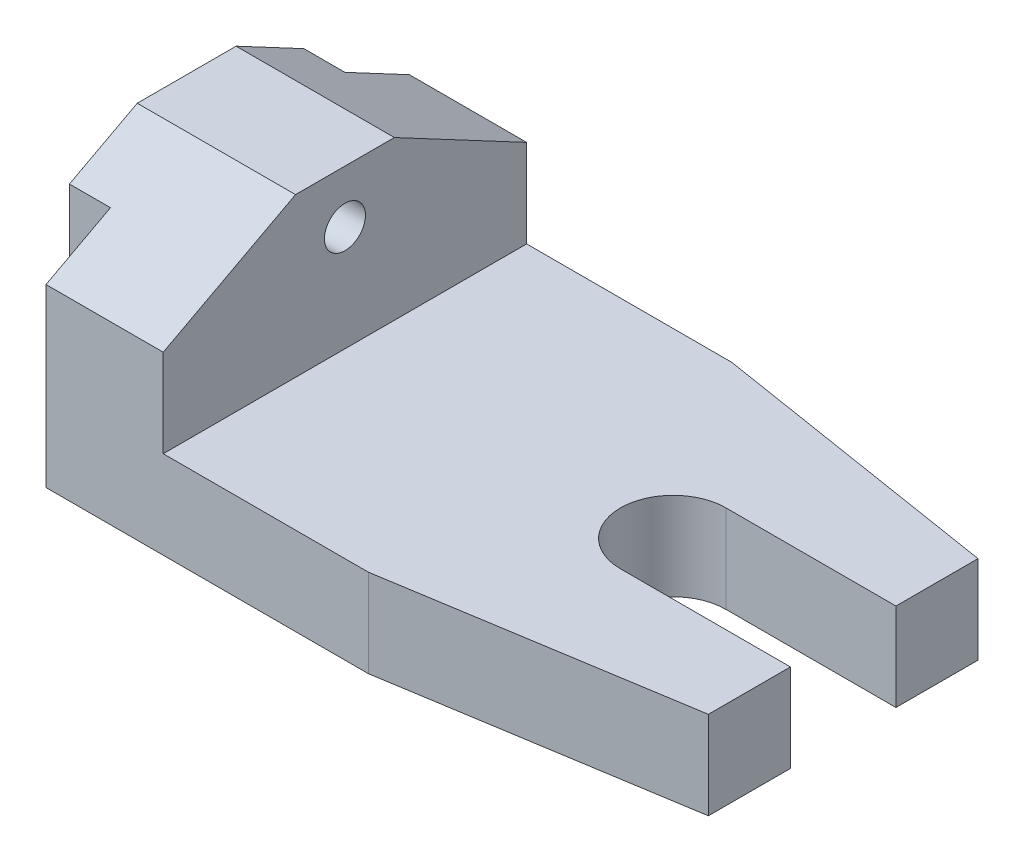
ISO-10303-21;
HEADER;
FILE_DESCRIPTION(('STEP AP214'),'2;1');
FILE_NAME('part.step','',(''),(''),'','','');
FILE_SCHEMA(('AUTOMOTIVE_DESIGN { 1 0 10303 214 1 1 1 1 }'));
ENDSEC;
DATA;
#1=APPLICATION_CONTEXT('core data for automotive mechanical design processes');
#2=APPLICATION_PROTOCOL_DEFINITION('international standard','automotive_design',2000,#1);
#3=PRODUCT_CONTEXT('',#1,'mechanical');
#4=PRODUCT('Part','Part','',(#3));
#5=PRODUCT_RELATED_PRODUCT_CATEGORY('part','',(#4));
#6=PRODUCT_DEFINITION_FORMATION('','',#4);
#7=PRODUCT_DEFINITION_CONTEXT('part definition',#1,'design');
#8=PRODUCT_DEFINITION('design','',#6,#7);
#9=PRODUCT_DEFINITION_SHAPE('','',#8);
#10=(LENGTH_UNIT() NAMED_UNIT(*) SI_UNIT(.MILLI.,.METRE.));
#11=(NAMED_UNIT(*) PLANE_ANGLE_UNIT() SI_UNIT($,.RADIAN.));
#12=(NAMED_UNIT(*) SI_UNIT($,.STERADIAN.) SOLID_ANGLE_UNIT());
#13=UNCERTAINTY_MEASURE_WITH_UNIT(LENGTH_MEASURE(1.E-05),#10,'distance_accuracy_value','');
#14=(GEOMETRIC_REPRESENTATION_CONTEXT(3) GLOBAL_UNCERTAINTY_ASSIGNED_CONTEXT((#13)) GLOBAL_UNIT_ASSIGNED_CONTEXT((#10,
#11,#12)) REPRESENTATION_CONTEXT('',''));
#15=CARTESIAN_POINT('',(0.,0.,0.));
#16=DIRECTION('',(0.,0.,1.));
#17=DIRECTION('',(1.,0.,0.));
#18=AXIS2_PLACEMENT_3D('',#15,#16,#17);
#19=CARTESIAN_POINT('',(0.,15.,-31.));
#20=DIRECTION('',(0.,0.,-1.));
#21=DIRECTION('',(-1.,0.,0.));
#22=AXIS2_PLACEMENT_3D('',#19,#20,#21);
#23=PLANE('',#22);
#24=DIRECTION('',(0.,-1.,0.));
#25=VECTOR('',#24,1.);
#26=CARTESIAN_POINT('',(7.,42.,-31.));
#27=LINE('',#26,#25);
#28=CARTESIAN_POINT('',(7.,30.,-31.));
#29=VERTEX_POINT('',#28);
#30=CARTESIAN_POINT('',(7.,0.,-31.));
#31=VERTEX_POINT('',#30);
#32=EDGE_CURVE('E209',#29,#31,#27,.T.);
#33=ORIENTED_EDGE('',*,*,#32,.F.);
#34=DIRECTION('',(1.,0.,0.));
#35=VECTOR('',#34,1.);
#36=CARTESIAN_POINT('',(-0.00100000000000447,30.,-31.));
#37=LINE('',#36,#35);
#38=CARTESIAN_POINT('',(27.,30.,-31.));
#39=VERTEX_POINT('',#38);
#40=EDGE_CURVE('E541',#29,#39,#37,.T.);
#41=ORIENTED_EDGE('',*,*,#40,.T.);
#42=DIRECTION('',(0.,-1.,0.));
#43=VECTOR('',#42,1.);
#44=CARTESIAN_POINT('',(27.,42.,-31.));
#45=LINE('',#44,#43);
#46=CARTESIAN_POINT('',(27.,15.,-31.));
#47=VERTEX_POINT('',#46);
#48=EDGE_CURVE('E215',#39,#47,#45,.T.);
#49=ORIENTED_EDGE('',*,*,#48,.T.);
#50=DIRECTION('',(1.,0.,0.));
#51=VECTOR('',#50,1.);
#52=CARTESIAN_POINT('',(0.,15.,-31.));
#53=LINE('',#52,#51);
#54=CARTESIAN_POINT('',(62.,15.,-31.));
#55=VERTEX_POINT('',#54);
#56=EDGE_CURVE('E233',#47,#55,#53,.T.);
#57=ORIENTED_EDGE('',*,*,#56,.T.);
#58=DIRECTION('',(0.,-1.,0.));
#59=VECTOR('',#58,1.);
#60=CARTESIAN_POINT('',(62.,15.,-31.));
#61=LINE('',#60,#59);
#62=CARTESIAN_POINT('',(62.,0.,-31.));
#63=VERTEX_POINT('',#62);
#64=EDGE_CURVE('E285',#55,#63,#61,.T.);
#65=ORIENTED_EDGE('',*,*,#64,.T.);
#66=DIRECTION('',(1.,0.,0.));
#67=VECTOR('',#66,1.);
#68=CARTESIAN_POINT('',(0.,0.,-31.));
#69=LINE('',#68,#67);
#70=EDGE_CURVE('E261',#31,#63,#69,.T.);
#71=ORIENTED_EDGE('',*,*,#70,.F.);
#72=EDGE_LOOP('',(#33,#41,#49,#57,#65,#71));
#73=FACE_BOUND('',#72,.T.);
#74=ADVANCED_FACE('F39',(#73),#23,.T.);
#75=CARTESIAN_POINT('',(0.,15.,31.));
#76=DIRECTION('',(0.,0.,-1.));
#77=DIRECTION('',(-1.,0.,0.));
#78=AXIS2_PLACEMENT_3D('',#75,#76,#77);
#79=PLANE('',#78);
#80=DIRECTION('',(1.,0.,0.));
#81=VECTOR('',#80,1.);
#82=CARTESIAN_POINT('',(-0.00100000000000447,30.,31.));
#83=LINE('',#82,#81);
#84=CARTESIAN_POINT('',(7.,30.,31.));
#85=VERTEX_POINT('',#84);
#86=CARTESIAN_POINT('',(27.,30.,31.));
#87=VERTEX_POINT('',#86);
#88=EDGE_CURVE('E172',#85,#87,#83,.T.);
#89=ORIENTED_EDGE('',*,*,#88,.F.);
#90=DIRECTION('',(0.,-1.,0.));
#91=VECTOR('',#90,1.);
#92=CARTESIAN_POINT('',(7.,42.,31.));
#93=LINE('',#92,#91);
#94=CARTESIAN_POINT('',(7.,0.,31.));
#95=VERTEX_POINT('',#94);
#96=EDGE_CURVE('E216',#85,#95,#93,.T.);
#97=ORIENTED_EDGE('',*,*,#96,.T.);
#98=DIRECTION('',(1.,0.,0.));
#99=VECTOR('',#98,1.);
#100=CARTESIAN_POINT('',(0.,0.,31.));
#101=LINE('',#100,#99);
#102=CARTESIAN_POINT('',(62.,0.,31.));
#103=VERTEX_POINT('',#102);
#104=EDGE_CURVE('E262',#95,#103,#101,.T.);
#105=ORIENTED_EDGE('',*,*,#104,.T.);
#106=DIRECTION('',(0.,-1.,0.));
#107=VECTOR('',#106,1.);
#108=CARTESIAN_POINT('',(62.,15.,31.));
#109=LINE('',#108,#107);
#110=CARTESIAN_POINT('',(62.,15.,31.));
#111=VERTEX_POINT('',#110);
#112=EDGE_CURVE('E276',#111,#103,#109,.T.);
#113=ORIENTED_EDGE('',*,*,#112,.F.);
#114=DIRECTION('',(1.,0.,0.));
#115=VECTOR('',#114,1.);
#116=CARTESIAN_POINT('',(0.,15.,31.));
#117=LINE('',#116,#115);
#118=CARTESIAN_POINT('',(27.,15.,31.));
#119=VERTEX_POINT('',#118);
#120=EDGE_CURVE('E242',#119,#111,#117,.T.);
#121=ORIENTED_EDGE('',*,*,#120,.F.);
#122=DIRECTION('',(0.,-1.,0.));
#123=VECTOR('',#122,1.);
#124=CARTESIAN_POINT('',(27.,42.,31.));
#125=LINE('',#124,#123);
#126=EDGE_CURVE('E212',#87,#119,#125,.T.);
#127=ORIENTED_EDGE('',*,*,#126,.F.);
#128=EDGE_LOOP('',(#89,#97,#105,#113,#121,#127));
#129=FACE_BOUND('',#128,.T.);
#130=ADVANCED_FACE('F353',(#129),#79,.F.);
#131=CARTESIAN_POINT('',(0.,42.,0.));
#132=DIRECTION('',(0.,1.,0.));
#133=DIRECTION('',(0.,0.,1.));
#134=AXIS2_PLACEMENT_3D('',#131,#132,#133);
#135=PLANE('',#134);
#136=DIRECTION('',(1.,0.,0.));
#137=VECTOR('',#136,1.);
#138=CARTESIAN_POINT('',(-0.00100000000000447,42.,-8.43128241584371));
#139=LINE('',#138,#137);
#140=CARTESIAN_POINT('',(0.,42.,-8.43128241584371));
#141=VERTEX_POINT('',#140);
#142=CARTESIAN_POINT('',(27.,42.,-8.43128241584371));
#143=VERTEX_POINT('',#142);
#144=EDGE_CURVE('E184',#141,#143,#139,.T.);
#145=ORIENTED_EDGE('',*,*,#144,.F.);
#146=DIRECTION('',(0.,0.,1.));
#147=VECTOR('',#146,1.);
#148=CARTESIAN_POINT('',(0.,42.,0.));
#149=LINE('',#148,#147);
#150=CARTESIAN_POINT('',(0.,42.,8.43128241584371));
#151=VERTEX_POINT('',#150);
#152=EDGE_CURVE('E179',#141,#151,#149,.T.);
#153=ORIENTED_EDGE('',*,*,#152,.T.);
#154=DIRECTION('',(1.,0.,0.));
#155=VECTOR('',#154,1.);
#156=CARTESIAN_POINT('',(-0.00100000000000447,42.,8.43128241584371));
#157=LINE('',#156,#155);
#158=CARTESIAN_POINT('',(27.,42.,8.43128241584371));
#159=VERTEX_POINT('',#158);
#160=EDGE_CURVE('E161',#151,#159,#157,.T.);
#161=ORIENTED_EDGE('',*,*,#160,.T.);
#162=DIRECTION('',(0.,0.,-1.));
#163=VECTOR('',#162,1.);
#164=CARTESIAN_POINT('',(27.,42.,0.));
#165=LINE('',#164,#163);
#166=EDGE_CURVE('E183',#159,#143,#165,.T.);
#167=ORIENTED_EDGE('',*,*,#166,.T.);
#168=EDGE_LOOP('',(#145,#153,#161,#167));
#169=FACE_BOUND('',#168,.T.);
#170=ADVANCED_FACE('F181',(#169),#135,.T.);
#171=CARTESIAN_POINT('',(27.,42.,0.));
#172=DIRECTION('',(-1.,0.,0.));
#173=DIRECTION('',(0.,0.,1.));
#174=AXIS2_PLACEMENT_3D('',#171,#172,#173);
#175=PLANE('',#174);
#176=CARTESIAN_POINT('',(27.,33.,0.));
#177=DIRECTION('',(1.,0.,0.));
#178=DIRECTION('',(0.,0.,-1.));
#179=AXIS2_PLACEMENT_3D('',#176,#177,#178);
#180=CIRCLE('',#179,3.5);
#181=CARTESIAN_POINT('',(27.,33.,-3.5));
#182=VERTEX_POINT('',#181);
#183=EDGE_CURVE('E531',#182,#182,#180,.T.);
#184=ORIENTED_EDGE('',*,*,#183,.F.);
#185=EDGE_LOOP('',(#184));
#186=FACE_BOUND('',#185,.T.);
#187=DIRECTION('',(0.,-0.469471562785886,-0.88294759285893));
#188=VECTOR('',#187,1.);
#189=CARTESIAN_POINT('',(27.,36.2379759266644,-19.2680735845288));
#190=LINE('',#189,#188);
#191=EDGE_CURVE('E543',#143,#39,#190,.T.);
#192=ORIENTED_EDGE('',*,*,#191,.F.);
#193=ORIENTED_EDGE('',*,*,#166,.F.);
#194=DIRECTION('',(0.,-0.469471562785886,0.88294759285893));
#195=VECTOR('',#194,1.);
#196=CARTESIAN_POINT('',(27.,36.2379759266644,19.2680735845288));
#197=LINE('',#196,#195);
#198=EDGE_CURVE('E167',#159,#87,#197,.T.);
#199=ORIENTED_EDGE('',*,*,#198,.T.);
#200=ORIENTED_EDGE('',*,*,#126,.T.);
#201=DIRECTION('',(0.,0.,-1.));
#202=VECTOR('',#201,1.);
#203=CARTESIAN_POINT('',(27.,15.,0.));
#204=LINE('',#203,#202);
#205=EDGE_CURVE('E236',#119,#47,#204,.T.);
#206=ORIENTED_EDGE('',*,*,#205,.T.);
#207=ORIENTED_EDGE('',*,*,#48,.F.);
#208=EDGE_LOOP('',(#192,#193,#199,#200,#206,#207));
#209=FACE_BOUND('',#208,.T.);
#210=ADVANCED_FACE('F352',(#186,#209),#175,.F.);
#211=CARTESIAN_POINT('',(0.,42.,0.));
#212=DIRECTION('',(1.,0.,0.));
#213=DIRECTION('',(0.,0.,-1.));
#214=AXIS2_PLACEMENT_3D('',#211,#212,#213);
#215=PLANE('',#214);
#216=CARTESIAN_POINT('',(0.,33.,0.));
#217=DIRECTION('',(1.,0.,0.));
#218=DIRECTION('',(0.,0.,-1.));
#219=AXIS2_PLACEMENT_3D('',#216,#217,#218);
#220=CIRCLE('',#219,3.5);
#221=CARTESIAN_POINT('',(0.,33.,-3.5));
#222=VERTEX_POINT('',#221);
#223=EDGE_CURVE('E191',#222,#222,#220,.F.);
#224=ORIENTED_EDGE('',*,*,#223,.F.);
#225=EDGE_LOOP('',(#224));
#226=FACE_BOUND('',#225,.T.);
#227=DIRECTION('',(0.,0.469471562785886,0.88294759285893));
#228=VECTOR('',#227,1.);
#229=CARTESIAN_POINT('',(0.,36.2379759266644,-19.2680735845288));
#230=LINE('',#229,#228);
#231=CARTESIAN_POINT('',(0.,35.8488037482762,-20.));
#232=VERTEX_POINT('',#231);
#233=EDGE_CURVE('E340',#232,#141,#230,.T.);
#234=ORIENTED_EDGE('',*,*,#233,.F.);
#235=DIRECTION('',(0.,-1.,0.));
#236=VECTOR('',#235,1.);
#237=CARTESIAN_POINT('',(0.,42.,-20.));
#238=LINE('',#237,#236);
#239=CARTESIAN_POINT('',(0.,0.,-20.));
#240=VERTEX_POINT('',#239);
#241=EDGE_CURVE('E189',#232,#240,#238,.T.);
#242=ORIENTED_EDGE('',*,*,#241,.T.);
#243=DIRECTION('',(0.,0.,1.));
#244=VECTOR('',#243,1.);
#245=CARTESIAN_POINT('',(0.,0.,0.));
#246=LINE('',#245,#244);
#247=CARTESIAN_POINT('',(0.,0.,20.));
#248=VERTEX_POINT('',#247);
#249=EDGE_CURVE('E197',#240,#248,#246,.T.);
#250=ORIENTED_EDGE('',*,*,#249,.T.);
#251=DIRECTION('',(0.,-1.,0.));
#252=VECTOR('',#251,1.);
#253=CARTESIAN_POINT('',(0.,42.,20.));
#254=LINE('',#253,#252);
#255=CARTESIAN_POINT('',(0.,35.8488037482762,20.));
#256=VERTEX_POINT('',#255);
#257=EDGE_CURVE('E178',#256,#248,#254,.T.);
#258=ORIENTED_EDGE('',*,*,#257,.F.);
#259=DIRECTION('',(0.,0.469471562785886,-0.88294759285893));
#260=VECTOR('',#259,1.);
#261=CARTESIAN_POINT('',(0.,36.2379759266644,19.2680735845288));
#262=LINE('',#261,#260);
#263=EDGE_CURVE('E163',#256,#151,#262,.T.);
#264=ORIENTED_EDGE('',*,*,#263,.T.);
#265=ORIENTED_EDGE('',*,*,#152,.F.);
#266=EDGE_LOOP('',(#234,#242,#250,#258,#264,#265));
#267=FACE_BOUND('',#266,.T.);
#268=ADVANCED_FACE('F180',(#226,#267),#215,.F.);
#269=CARTESIAN_POINT('',(0.,42.,20.));
#270=DIRECTION('',(0.,0.,1.));
#271=DIRECTION('',(1.,0.,0.));
#272=AXIS2_PLACEMENT_3D('',#269,#270,#271);
#273=PLANE('',#272);
#274=DIRECTION('',(0.,-1.,0.));
#275=VECTOR('',#274,1.);
#276=CARTESIAN_POINT('',(7.,42.,20.));
#277=LINE('',#276,#275);
#278=CARTESIAN_POINT('',(7.,35.8488037482762,20.));
#279=VERTEX_POINT('',#278);
#280=CARTESIAN_POINT('',(7.,0.,20.));
#281=VERTEX_POINT('',#280);
#282=EDGE_CURVE('E217',#279,#281,#277,.T.);
#283=ORIENTED_EDGE('',*,*,#282,.F.);
#284=DIRECTION('',(1.,0.,0.));
#285=VECTOR('',#284,1.);
#286=CARTESIAN_POINT('',(-0.001000000000004,35.8488037482762,20.));
#287=LINE('',#286,#285);
#288=EDGE_CURVE('E53',#256,#279,#287,.T.);
#289=ORIENTED_EDGE('',*,*,#288,.F.);
#290=ORIENTED_EDGE('',*,*,#257,.T.);
#291=DIRECTION('',(-1.,0.,0.));
#292=VECTOR('',#291,1.);
#293=CARTESIAN_POINT('',(0.,0.,20.));
#294=LINE('',#293,#292);
#295=EDGE_CURVE('E200',#281,#248,#294,.T.);
#296=ORIENTED_EDGE('',*,*,#295,.F.);
#297=EDGE_LOOP('',(#283,#289,#290,#296));
#298=FACE_BOUND('',#297,.T.);
#299=ADVANCED_FACE('F334',(#298),#273,.T.);
#300=CARTESIAN_POINT('',(7.,42.,0.));
#301=DIRECTION('',(-1.,0.,0.));
#302=DIRECTION('',(0.,0.,1.));
#303=AXIS2_PLACEMENT_3D('',#300,#301,#302);
#304=PLANE('',#303);
#305=ORIENTED_EDGE('',*,*,#96,.F.);
#306=DIRECTION('',(0.,-0.469471562785886,0.88294759285893));
#307=VECTOR('',#306,1.);
#308=CARTESIAN_POINT('',(7.,36.2379759266644,19.2680735845288));
#309=LINE('',#308,#307);
#310=EDGE_CURVE('E332',#279,#85,#309,.T.);
#311=ORIENTED_EDGE('',*,*,#310,.F.);
#312=ORIENTED_EDGE('',*,*,#282,.T.);
#313=DIRECTION('',(0.,0.,-1.));
#314=VECTOR('',#313,1.);
#315=CARTESIAN_POINT('',(7.,0.,0.));
#316=LINE('',#315,#314);
#317=EDGE_CURVE('E205',#95,#281,#316,.T.);
#318=ORIENTED_EDGE('',*,*,#317,.F.);
#319=EDGE_LOOP('',(#305,#311,#312,#318));
#320=FACE_BOUND('',#319,.T.);
#321=ADVANCED_FACE('F327',(#320),#304,.T.);
#322=CARTESIAN_POINT('',(83.,15.,0.));
#323=DIRECTION('',(0.,-1.,0.));
#324=DIRECTION('',(0.,0.,-1.));
#325=AXIS2_PLACEMENT_3D('',#322,#323,#324);
#326=CYLINDRICAL_SURFACE('',#325,9.);
#327=CARTESIAN_POINT('',(83.,0.,0.));
#328=DIRECTION('',(0.,1.,0.));
#329=DIRECTION('',(0.,0.,1.));
#330=AXIS2_PLACEMENT_3D('',#327,#328,#329);
#331=CIRCLE('',#330,9.);
#332=CARTESIAN_POINT('',(83.,0.,-9.));
#333=VERTEX_POINT('',#332);
#334=CARTESIAN_POINT('',(83.,0.,9.));
#335=VERTEX_POINT('',#334);
#336=EDGE_CURVE('E222',#333,#335,#331,.T.);
#337=ORIENTED_EDGE('',*,*,#336,.F.);
#338=DIRECTION('',(0.,-1.,0.));
#339=VECTOR('',#338,1.);
#340=CARTESIAN_POINT('',(83.,15.,-9.));
#341=LINE('',#340,#339);
#342=CARTESIAN_POINT('',(83.,15.,-9.));
#343=VERTEX_POINT('',#342);
#344=EDGE_CURVE('E11',#343,#333,#341,.T.);
#345=ORIENTED_EDGE('',*,*,#344,.F.);
#346=CARTESIAN_POINT('',(83.,15.,0.));
#347=DIRECTION('',(0.,1.,0.));
#348=DIRECTION('',(0.,0.,1.));
#349=AXIS2_PLACEMENT_3D('',#346,#347,#348);
#350=CIRCLE('',#349,9.);
#351=CARTESIAN_POINT('',(83.,15.,9.));
#352=VERTEX_POINT('',#351);
#353=EDGE_CURVE('E225',#343,#352,#350,.T.);
#354=ORIENTED_EDGE('',*,*,#353,.T.);
#355=DIRECTION('',(0.,-1.,0.));
#356=VECTOR('',#355,1.);
#357=CARTESIAN_POINT('',(83.,15.,9.));
#358=LINE('',#357,#356);
#359=EDGE_CURVE('E246',#352,#335,#358,.T.);
#360=ORIENTED_EDGE('',*,*,#359,.T.);
#361=EDGE_LOOP('',(#337,#345,#354,#360));
#362=FACE_BOUND('',#361,.T.);
#363=ADVANCED_FACE('F41',(#362),#326,.F.);
#364=CARTESIAN_POINT('',(0.,15.,-8.99999999999998));
#365=DIRECTION('',(0.,0.,1.));
#366=DIRECTION('',(1.,0.,0.));
#367=AXIS2_PLACEMENT_3D('',#364,#365,#366);
#368=PLANE('',#367);
#369=DIRECTION('',(-1.,0.,0.));
#370=VECTOR('',#369,1.);
#371=CARTESIAN_POINT('',(0.,0.,-8.99999999999998));
#372=LINE('',#371,#370);
#373=CARTESIAN_POINT('',(112.,0.,-9.));
#374=VERTEX_POINT('',#373);
#375=EDGE_CURVE('E252',#374,#333,#372,.T.);
#376=ORIENTED_EDGE('',*,*,#375,.F.);
#377=DIRECTION('',(0.,-1.,0.));
#378=VECTOR('',#377,1.);
#379=CARTESIAN_POINT('',(112.,15.,-9.));
#380=LINE('',#379,#378);
#381=CARTESIAN_POINT('',(112.,15.,-9.));
#382=VERTEX_POINT('',#381);
#383=EDGE_CURVE('E50',#382,#374,#380,.T.);
#384=ORIENTED_EDGE('',*,*,#383,.F.);
#385=DIRECTION('',(-1.,0.,0.));
#386=VECTOR('',#385,1.);
#387=CARTESIAN_POINT('',(0.,15.,-8.99999999999998));
#388=LINE('',#387,#386);
#389=EDGE_CURVE('E223',#382,#343,#388,.T.);
#390=ORIENTED_EDGE('',*,*,#389,.T.);
#391=ORIENTED_EDGE('',*,*,#344,.T.);
#392=EDGE_LOOP('',(#376,#384,#390,#391));
#393=FACE_BOUND('',#392,.T.);
#394=ADVANCED_FACE('F295',(#393),#368,.T.);
#395=CARTESIAN_POINT('',(112.,15.,0.));
#396=DIRECTION('',(1.,0.,0.));
#397=DIRECTION('',(0.,0.,-1.));
#398=AXIS2_PLACEMENT_3D('',#395,#396,#397);
#399=PLANE('',#398);
#400=DIRECTION('',(0.,0.,1.));
#401=VECTOR('',#400,1.);
#402=CARTESIAN_POINT('',(112.,0.,0.));
#403=LINE('',#402,#401);
#404=CARTESIAN_POINT('',(112.,0.,-23.));
#405=VERTEX_POINT('',#404);
#406=EDGE_CURVE('E254',#405,#374,#403,.T.);
#407=ORIENTED_EDGE('',*,*,#406,.F.);
#408=DIRECTION('',(0.,-1.,0.));
#409=VECTOR('',#408,1.);
#410=CARTESIAN_POINT('',(112.,15.,-23.));
#411=LINE('',#410,#409);
#412=CARTESIAN_POINT('',(112.,15.,-23.));
#413=VERTEX_POINT('',#412);
#414=EDGE_CURVE('E281',#413,#405,#411,.T.);
#415=ORIENTED_EDGE('',*,*,#414,.F.);
#416=DIRECTION('',(0.,0.,1.));
#417=VECTOR('',#416,1.);
#418=CARTESIAN_POINT('',(112.,15.,0.));
#419=LINE('',#418,#417);
#420=EDGE_CURVE('E226',#413,#382,#419,.T.);
#421=ORIENTED_EDGE('',*,*,#420,.T.);
#422=ORIENTED_EDGE('',*,*,#383,.T.);
#423=EDGE_LOOP('',(#407,#415,#421,#422));
#424=FACE_BOUND('',#423,.T.);
#425=ADVANCED_FACE('F289',(#424),#399,.T.);
#426=CARTESIAN_POINT('',(6.38377535101404,15.,-39.8985959438378));
#427=DIRECTION('',(0.157990501106673,0.,-0.987440631916705));
#428=DIRECTION('',(-0.987440631916705,0.,-0.157990501106673));
#429=AXIS2_PLACEMENT_3D('',#426,#427,#428);
#430=PLANE('',#429);
#431=DIRECTION('',(0.987440631916706,0.,0.157990501106673));
#432=VECTOR('',#431,1.);
#433=CARTESIAN_POINT('',(6.38377535101404,0.,-39.8985959438378));
#434=LINE('',#433,#432);
#435=EDGE_CURVE('E256',#63,#405,#434,.T.);
#436=ORIENTED_EDGE('',*,*,#435,.F.);
#437=ORIENTED_EDGE('',*,*,#64,.F.);
#438=DIRECTION('',(0.987440631916706,0.,0.157990501106673));
#439=VECTOR('',#438,1.);
#440=CARTESIAN_POINT('',(6.38377535101404,15.,-39.8985959438378));
#441=LINE('',#440,#439);
#442=EDGE_CURVE('E235',#55,#413,#441,.T.);
#443=ORIENTED_EDGE('',*,*,#442,.T.);
#444=ORIENTED_EDGE('',*,*,#414,.T.);
#445=EDGE_LOOP('',(#436,#437,#443,#444));
#446=FACE_BOUND('',#445,.T.);
#447=ADVANCED_FACE('F298',(#446),#430,.T.);
#448=CARTESIAN_POINT('',(6.38377535101404,15.,39.8985959438378));
#449=DIRECTION('',(-0.157990501106673,0.,-0.987440631916705));
#450=DIRECTION('',(-0.987440631916705,0.,0.157990501106673));
#451=AXIS2_PLACEMENT_3D('',#448,#449,#450);
#452=PLANE('',#451);
#453=DIRECTION('',(0.987440631916706,0.,-0.157990501106673));
#454=VECTOR('',#453,1.);
#455=CARTESIAN_POINT('',(6.38377535101404,0.,39.8985959438378));
#456=LINE('',#455,#454);
#457=CARTESIAN_POINT('',(112.,0.,23.));
#458=VERTEX_POINT('',#457);
#459=EDGE_CURVE('E266',#103,#458,#456,.T.);
#460=ORIENTED_EDGE('',*,*,#459,.T.);
#461=DIRECTION('',(0.,-1.,0.));
#462=VECTOR('',#461,1.);
#463=CARTESIAN_POINT('',(112.,15.,23.));
#464=LINE('',#463,#462);
#465=CARTESIAN_POINT('',(112.,15.,23.));
#466=VERTEX_POINT('',#465);
#467=EDGE_CURVE('E277',#466,#458,#464,.T.);
#468=ORIENTED_EDGE('',*,*,#467,.F.);
#469=DIRECTION('',(0.987440631916706,0.,-0.157990501106673));
#470=VECTOR('',#469,1.);
#471=CARTESIAN_POINT('',(6.38377535101404,15.,39.8985959438378));
#472=LINE('',#471,#470);
#473=EDGE_CURVE('E244',#111,#466,#472,.T.);
#474=ORIENTED_EDGE('',*,*,#473,.F.);
#475=ORIENTED_EDGE('',*,*,#112,.T.);
#476=EDGE_LOOP('',(#460,#468,#474,#475));
#477=FACE_BOUND('',#476,.T.);
#478=ADVANCED_FACE('F321',(#477),#452,.F.);
#479=CARTESIAN_POINT('',(112.,15.,0.));
#480=DIRECTION('',(-1.,0.,0.));
#481=DIRECTION('',(0.,0.,1.));
#482=AXIS2_PLACEMENT_3D('',#479,#480,#481);
#483=PLANE('',#482);
#484=DIRECTION('',(0.,0.,-1.));
#485=VECTOR('',#484,1.);
#486=CARTESIAN_POINT('',(112.,0.,0.));
#487=LINE('',#486,#485);
#488=CARTESIAN_POINT('',(112.,0.,9.));
#489=VERTEX_POINT('',#488);
#490=EDGE_CURVE('E268',#458,#489,#487,.T.);
#491=ORIENTED_EDGE('',*,*,#490,.T.);
#492=DIRECTION('',(0.,-1.,0.));
#493=VECTOR('',#492,1.);
#494=CARTESIAN_POINT('',(112.,15.,9.));
#495=LINE('',#494,#493);
#496=CARTESIAN_POINT('',(112.,15.,9.));
#497=VERTEX_POINT('',#496);
#498=EDGE_CURVE('E272',#497,#489,#495,.T.);
#499=ORIENTED_EDGE('',*,*,#498,.F.);
#500=DIRECTION('',(0.,0.,-1.));
#501=VECTOR('',#500,1.);
#502=CARTESIAN_POINT('',(112.,15.,0.));
#503=LINE('',#502,#501);
#504=EDGE_CURVE('E243',#466,#497,#503,.T.);
#505=ORIENTED_EDGE('',*,*,#504,.F.);
#506=ORIENTED_EDGE('',*,*,#467,.T.);
#507=EDGE_LOOP('',(#491,#499,#505,#506));
#508=FACE_BOUND('',#507,.T.);
#509=ADVANCED_FACE('F320',(#508),#483,.F.);
#510=CARTESIAN_POINT('',(0.,15.,8.99999999999998));
#511=DIRECTION('',(0.,0.,1.));
#512=DIRECTION('',(1.,0.,0.));
#513=AXIS2_PLACEMENT_3D('',#510,#511,#512);
#514=PLANE('',#513);
#515=DIRECTION('',(-1.,0.,0.));
#516=VECTOR('',#515,1.);
#517=CARTESIAN_POINT('',(0.,0.,8.99999999999998));
#518=LINE('',#517,#516);
#519=EDGE_CURVE('E227',#489,#335,#518,.T.);
#520=ORIENTED_EDGE('',*,*,#519,.T.);
#521=ORIENTED_EDGE('',*,*,#359,.F.);
#522=DIRECTION('',(-1.,0.,0.));
#523=VECTOR('',#522,1.);
#524=CARTESIAN_POINT('',(0.,15.,8.99999999999998));
#525=LINE('',#524,#523);
#526=EDGE_CURVE('E250',#497,#352,#525,.T.);
#527=ORIENTED_EDGE('',*,*,#526,.F.);
#528=ORIENTED_EDGE('',*,*,#498,.T.);
#529=EDGE_LOOP('',(#520,#521,#527,#528));
#530=FACE_BOUND('',#529,.T.);
#531=ADVANCED_FACE('F311',(#530),#514,.F.);
#532=CARTESIAN_POINT('',(0.,15.,0.));
#533=DIRECTION('',(0.,1.,0.));
#534=DIRECTION('',(0.,0.,1.));
#535=AXIS2_PLACEMENT_3D('',#532,#533,#534);
#536=PLANE('',#535);
#537=ORIENTED_EDGE('',*,*,#353,.F.);
#538=ORIENTED_EDGE('',*,*,#389,.F.);
#539=ORIENTED_EDGE('',*,*,#420,.F.);
#540=ORIENTED_EDGE('',*,*,#442,.F.);
#541=ORIENTED_EDGE('',*,*,#56,.F.);
#542=ORIENTED_EDGE('',*,*,#205,.F.);
#543=ORIENTED_EDGE('',*,*,#120,.T.);
#544=ORIENTED_EDGE('',*,*,#473,.T.);
#545=ORIENTED_EDGE('',*,*,#504,.T.);
#546=ORIENTED_EDGE('',*,*,#526,.T.);
#547=EDGE_LOOP('',(#537,#538,#539,#540,#541,#542,#543,#544,#545,#546));
#548=FACE_BOUND('',#547,.T.);
#549=ADVANCED_FACE('F301',(#548),#536,.T.);
#550=CARTESIAN_POINT('',(0.,0.,0.));
#551=DIRECTION('',(0.,1.,0.));
#552=DIRECTION('',(0.,0.,1.));
#553=AXIS2_PLACEMENT_3D('',#550,#551,#552);
#554=PLANE('',#553);
#555=ORIENTED_EDGE('',*,*,#336,.T.);
#556=ORIENTED_EDGE('',*,*,#519,.F.);
#557=ORIENTED_EDGE('',*,*,#490,.F.);
#558=ORIENTED_EDGE('',*,*,#459,.F.);
#559=ORIENTED_EDGE('',*,*,#104,.F.);
#560=ORIENTED_EDGE('',*,*,#317,.T.);
#561=ORIENTED_EDGE('',*,*,#295,.T.);
#562=ORIENTED_EDGE('',*,*,#249,.F.);
#563=DIRECTION('',(-1.,0.,0.));
#564=VECTOR('',#563,1.);
#565=CARTESIAN_POINT('',(0.,0.,-20.));
#566=LINE('',#565,#564);
#567=CARTESIAN_POINT('',(7.,0.,-20.));
#568=VERTEX_POINT('',#567);
#569=EDGE_CURVE('E187',#568,#240,#566,.T.);
#570=ORIENTED_EDGE('',*,*,#569,.F.);
#571=DIRECTION('',(0.,0.,1.));
#572=VECTOR('',#571,1.);
#573=CARTESIAN_POINT('',(7.,0.,0.));
#574=LINE('',#573,#572);
#575=EDGE_CURVE('E192',#31,#568,#574,.T.);
#576=ORIENTED_EDGE('',*,*,#575,.F.);
#577=ORIENTED_EDGE('',*,*,#70,.T.);
#578=ORIENTED_EDGE('',*,*,#435,.T.);
#579=ORIENTED_EDGE('',*,*,#406,.T.);
#580=ORIENTED_EDGE('',*,*,#375,.T.);
#581=EDGE_LOOP('',(#555,#556,#557,#558,#559,#560,#561,#562,#570,#576,#577,#578,#579,#580));
#582=FACE_BOUND('',#581,.T.);
#583=ADVANCED_FACE('F293',(#582),#554,.F.);
#584=CARTESIAN_POINT('',(7.,42.,0.));
#585=DIRECTION('',(1.,0.,0.));
#586=DIRECTION('',(0.,0.,-1.));
#587=AXIS2_PLACEMENT_3D('',#584,#585,#586);
#588=PLANE('',#587);
#589=DIRECTION('',(0.,-1.,0.));
#590=VECTOR('',#589,1.);
#591=CARTESIAN_POINT('',(7.,42.,-20.));
#592=LINE('',#591,#590);
#593=CARTESIAN_POINT('',(7.,35.8488037482762,-20.));
#594=VERTEX_POINT('',#593);
#595=EDGE_CURVE('E208',#594,#568,#592,.T.);
#596=ORIENTED_EDGE('',*,*,#595,.F.);
#597=DIRECTION('',(0.,0.469471562785886,0.88294759285893));
#598=VECTOR('',#597,1.);
#599=CARTESIAN_POINT('',(7.,36.2379759266644,-19.2680735845288));
#600=LINE('',#599,#598);
#601=EDGE_CURVE('E65',#29,#594,#600,.T.);
#602=ORIENTED_EDGE('',*,*,#601,.F.);
#603=ORIENTED_EDGE('',*,*,#32,.T.);
#604=ORIENTED_EDGE('',*,*,#575,.T.);
#605=EDGE_LOOP('',(#596,#602,#603,#604));
#606=FACE_BOUND('',#605,.T.);
#607=ADVANCED_FACE('F344',(#606),#588,.F.);
#608=CARTESIAN_POINT('',(0.,42.,-20.));
#609=DIRECTION('',(0.,0.,1.));
#610=DIRECTION('',(1.,0.,0.));
#611=AXIS2_PLACEMENT_3D('',#608,#609,#610);
#612=PLANE('',#611);
#613=ORIENTED_EDGE('',*,*,#241,.F.);
#614=DIRECTION('',(-1.,0.,0.));
#615=VECTOR('',#614,1.);
#616=CARTESIAN_POINT('',(-0.001000000000004,35.8488037482762,-20.));
#617=LINE('',#616,#615);
#618=EDGE_CURVE('E342',#594,#232,#617,.T.);
#619=ORIENTED_EDGE('',*,*,#618,.F.);
#620=ORIENTED_EDGE('',*,*,#595,.T.);
#621=ORIENTED_EDGE('',*,*,#569,.T.);
#622=EDGE_LOOP('',(#613,#619,#620,#621));
#623=FACE_BOUND('',#622,.T.);
#624=ADVANCED_FACE('F336',(#623),#612,.F.);
#625=CARTESIAN_POINT('',(-0.00100000000000447,36.2379759266644,-19.2680735845288));
#626=DIRECTION('',(0.,-0.88294759285893,0.469471562785886));
#627=DIRECTION('',(0.,-0.469471562785886,-0.88294759285893));
#628=AXIS2_PLACEMENT_3D('',#625,#626,#627);
#629=PLANE('',#628);
#630=ORIENTED_EDGE('',*,*,#233,.T.);
#631=ORIENTED_EDGE('',*,*,#144,.T.);
#632=ORIENTED_EDGE('',*,*,#191,.T.);
#633=ORIENTED_EDGE('',*,*,#40,.F.);
#634=ORIENTED_EDGE('',*,*,#601,.T.);
#635=ORIENTED_EDGE('',*,*,#618,.T.);
#636=EDGE_LOOP('',(#630,#631,#632,#633,#634,#635));
#637=FACE_BOUND('',#636,.T.);
#638=ADVANCED_FACE('F453',(#637),#629,.F.);
#639=CARTESIAN_POINT('',(-0.00100000000000447,36.2379759266644,19.2680735845288));
#640=DIRECTION('',(0.,0.88294759285893,0.469471562785886));
#641=DIRECTION('',(0.,-0.469471562785886,0.88294759285893));
#642=AXIS2_PLACEMENT_3D('',#639,#640,#641);
#643=PLANE('',#642);
#644=ORIENTED_EDGE('',*,*,#288,.T.);
#645=ORIENTED_EDGE('',*,*,#310,.T.);
#646=ORIENTED_EDGE('',*,*,#88,.T.);
#647=ORIENTED_EDGE('',*,*,#198,.F.);
#648=ORIENTED_EDGE('',*,*,#160,.F.);
#649=ORIENTED_EDGE('',*,*,#263,.F.);
#650=EDGE_LOOP('',(#644,#645,#646,#647,#648,#649));
#651=FACE_BOUND('',#650,.T.);
#652=ADVANCED_FACE('F162',(#651),#643,.T.);
#653=CARTESIAN_POINT('',(-0.00100000000000447,33.,0.));
#654=DIRECTION('',(1.,0.,0.));
#655=DIRECTION('',(0.,0.,-1.));
#656=AXIS2_PLACEMENT_3D('',#653,#654,#655);
#657=CYLINDRICAL_SURFACE('',#656,3.5);
#658=ORIENTED_EDGE('',*,*,#183,.T.);
#659=EDGE_LOOP('',(#658));
#660=FACE_BOUND('',#659,.T.);
#661=ORIENTED_EDGE('',*,*,#223,.T.);
#662=EDGE_LOOP('',(#661));
#663=FACE_BOUND('',#662,.T.);
#664=ADVANCED_FACE('F514',(#660,#663),#657,.F.);
#665=CLOSED_SHELL('',(#74,#130,#170,#210,#268,#299,#321,#363,#394,#425,#447,#478,#509,#531,#549,
#583,#607,#624,#638,#652,#664));
#666=MANIFOLD_SOLID_BREP('B2',#665);
#667=ADVANCED_BREP_SHAPE_REPRESENTATION('',(#18,#666),#14);
#668=SHAPE_DEFINITION_REPRESENTATION(#9,#667);
ENDSEC;
END-ISO-10303-21;
